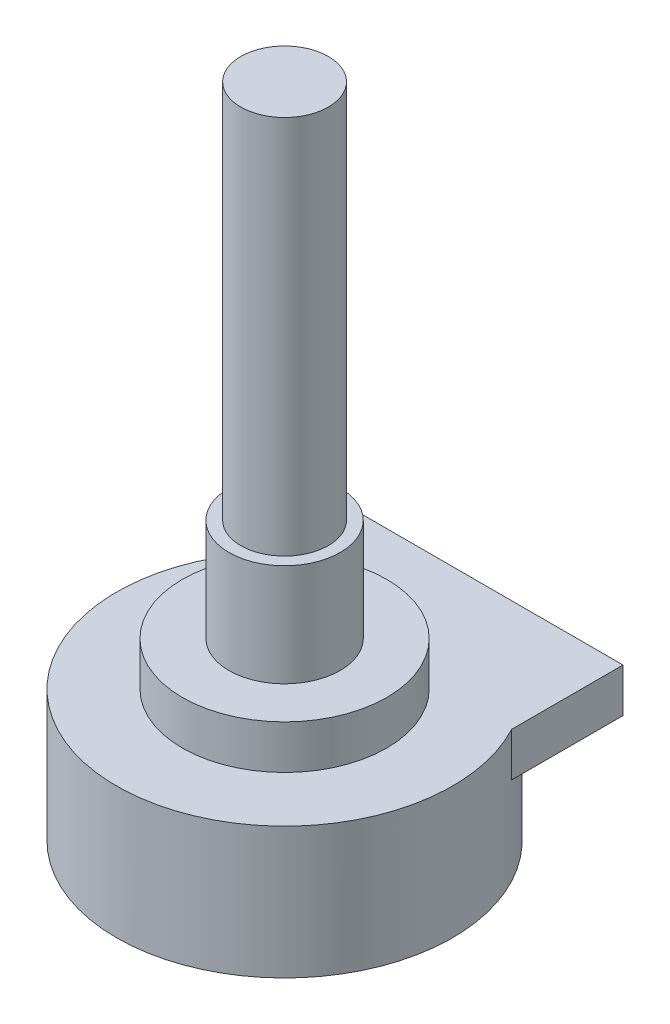
ISO-10303-21;
HEADER;
FILE_DESCRIPTION(('STEP AP214'),'2;1');
FILE_NAME('part.step','',(''),(''),'','','');
FILE_SCHEMA(('AUTOMOTIVE_DESIGN { 1 0 10303 214 1 1 1 1 }'));
ENDSEC;
DATA;
#1=APPLICATION_CONTEXT('core data for automotive mechanical design processes');
#2=APPLICATION_PROTOCOL_DEFINITION('international standard','automotive_design',2000,#1);
#3=PRODUCT_CONTEXT('',#1,'mechanical');
#4=PRODUCT('Part','Part','',(#3));
#5=PRODUCT_RELATED_PRODUCT_CATEGORY('part','',(#4));
#6=PRODUCT_DEFINITION_FORMATION('','',#4);
#7=PRODUCT_DEFINITION_CONTEXT('part definition',#1,'design');
#8=PRODUCT_DEFINITION('design','',#6,#7);
#9=PRODUCT_DEFINITION_SHAPE('','',#8);
#10=(LENGTH_UNIT() NAMED_UNIT(*) SI_UNIT(.MILLI.,.METRE.));
#11=(NAMED_UNIT(*) PLANE_ANGLE_UNIT() SI_UNIT($,.RADIAN.));
#12=(NAMED_UNIT(*) SI_UNIT($,.STERADIAN.) SOLID_ANGLE_UNIT());
#13=UNCERTAINTY_MEASURE_WITH_UNIT(LENGTH_MEASURE(1.E-05),#10,'distance_accuracy_value','');
#14=(GEOMETRIC_REPRESENTATION_CONTEXT(3) GLOBAL_UNCERTAINTY_ASSIGNED_CONTEXT((#13)) GLOBAL_UNIT_ASSIGNED_CONTEXT((#10,
#11,#12)) REPRESENTATION_CONTEXT('',''));
#15=CARTESIAN_POINT('',(0.,0.,0.));
#16=DIRECTION('',(0.,0.,1.));
#17=DIRECTION('',(1.,0.,0.));
#18=AXIS2_PLACEMENT_3D('',#15,#16,#17);
#19=CARTESIAN_POINT('',(11.2776,9.,0.));
#20=DIRECTION('',(1.,0.,0.));
#21=DIRECTION('',(0.,0.,-1.));
#22=AXIS2_PLACEMENT_3D('',#19,#20,#21);
#23=PLANE('',#22);
#24=DIRECTION('',(0.,-1.,0.));
#25=VECTOR('',#24,1.);
#26=CARTESIAN_POINT('',(11.2776,9.,-1.1684));
#27=LINE('',#26,#25);
#28=CARTESIAN_POINT('',(11.2776,9.,-1.1684));
#29=VERTEX_POINT('',#28);
#30=CARTESIAN_POINT('',(11.2776,6.,-1.1684));
#31=VERTEX_POINT('',#30);
#32=EDGE_CURVE('E92',#29,#31,#27,.T.);
#33=ORIENTED_EDGE('',*,*,#32,.T.);
#34=DIRECTION('',(0.,0.,1.));
#35=VECTOR('',#34,1.);
#36=CARTESIAN_POINT('',(11.2776,6.,-8.7884));
#37=LINE('',#36,#35);
#38=CARTESIAN_POINT('',(11.2776,6.,-8.7884));
#39=VERTEX_POINT('',#38);
#40=EDGE_CURVE('E80',#39,#31,#37,.T.);
#41=ORIENTED_EDGE('',*,*,#40,.F.);
#42=DIRECTION('',(0.,-1.,0.));
#43=VECTOR('',#42,1.);
#44=CARTESIAN_POINT('',(11.2776,9.,-8.7884));
#45=LINE('',#44,#43);
#46=CARTESIAN_POINT('',(11.2776,9.,-8.7884));
#47=VERTEX_POINT('',#46);
#48=EDGE_CURVE('E11',#47,#39,#45,.T.);
#49=ORIENTED_EDGE('',*,*,#48,.F.);
#50=DIRECTION('',(0.,0.,1.));
#51=VECTOR('',#50,1.);
#52=CARTESIAN_POINT('',(11.2776,9.,0.));
#53=LINE('',#52,#51);
#54=EDGE_CURVE('E107',#47,#29,#53,.T.);
#55=ORIENTED_EDGE('',*,*,#54,.T.);
#56=EDGE_LOOP('',(#33,#41,#49,#55));
#57=FACE_BOUND('',#56,.T.);
#58=ADVANCED_FACE('F36',(#57),#23,.T.);
#59=CARTESIAN_POINT('',(0.,9.,-8.7884));
#60=DIRECTION('',(0.,0.,-1.));
#61=DIRECTION('',(-1.,0.,0.));
#62=AXIS2_PLACEMENT_3D('',#59,#60,#61);
#63=PLANE('',#62);
#64=ORIENTED_EDGE('',*,*,#48,.T.);
#65=DIRECTION('',(1.,0.,0.));
#66=VECTOR('',#65,1.);
#67=CARTESIAN_POINT('',(-9.0424,6.,-8.7884));
#68=LINE('',#67,#66);
#69=CARTESIAN_POINT('',(-9.0424,6.,-8.7884));
#70=VERTEX_POINT('',#69);
#71=EDGE_CURVE('E89',#70,#39,#68,.T.);
#72=ORIENTED_EDGE('',*,*,#71,.F.);
#73=DIRECTION('',(0.,-1.,0.));
#74=VECTOR('',#73,1.);
#75=CARTESIAN_POINT('',(-9.0424,9.,-8.7884));
#76=LINE('',#75,#74);
#77=CARTESIAN_POINT('',(-9.0424,9.,-8.7884));
#78=VERTEX_POINT('',#77);
#79=EDGE_CURVE('E43',#78,#70,#76,.T.);
#80=ORIENTED_EDGE('',*,*,#79,.F.);
#81=DIRECTION('',(1.,0.,0.));
#82=VECTOR('',#81,1.);
#83=CARTESIAN_POINT('',(0.,9.,-8.7884));
#84=LINE('',#83,#82);
#85=EDGE_CURVE('E104',#78,#47,#84,.T.);
#86=ORIENTED_EDGE('',*,*,#85,.T.);
#87=EDGE_LOOP('',(#64,#72,#80,#86));
#88=FACE_BOUND('',#87,.T.);
#89=ADVANCED_FACE('F129',(#88),#63,.T.);
#90=CARTESIAN_POINT('',(-9.0424,9.,0.));
#91=DIRECTION('',(1.,0.,0.));
#92=DIRECTION('',(0.,0.,-1.));
#93=AXIS2_PLACEMENT_3D('',#90,#91,#92);
#94=PLANE('',#93);
#95=DIRECTION('',(0.,0.,-1.));
#96=VECTOR('',#95,1.);
#97=CARTESIAN_POINT('',(-9.0424,6.,-1.1684));
#98=LINE('',#97,#96);
#99=CARTESIAN_POINT('',(-9.0424,6.,-1.1684));
#100=VERTEX_POINT('',#99);
#101=EDGE_CURVE('E77',#100,#70,#98,.T.);
#102=ORIENTED_EDGE('',*,*,#101,.F.);
#103=DIRECTION('',(0.,-1.,0.));
#104=VECTOR('',#103,1.);
#105=CARTESIAN_POINT('',(-9.0424,9.,-1.1684));
#106=LINE('',#105,#104);
#107=CARTESIAN_POINT('',(-9.0424,9.,-1.1684));
#108=VERTEX_POINT('',#107);
#109=EDGE_CURVE('E88',#108,#100,#106,.T.);
#110=ORIENTED_EDGE('',*,*,#109,.F.);
#111=DIRECTION('',(0.,0.,1.));
#112=VECTOR('',#111,1.);
#113=CARTESIAN_POINT('',(-9.0424,9.,0.));
#114=LINE('',#113,#112);
#115=EDGE_CURVE('E102',#78,#108,#114,.T.);
#116=ORIENTED_EDGE('',*,*,#115,.F.);
#117=ORIENTED_EDGE('',*,*,#79,.T.);
#118=EDGE_LOOP('',(#102,#110,#116,#117));
#119=FACE_BOUND('',#118,.T.);
#120=ADVANCED_FACE('F86',(#119),#94,.F.);
#121=CARTESIAN_POINT('',(1.1176,9.,4.21902981392797));
#122=DIRECTION('',(0.,-1.,0.));
#123=DIRECTION('',(0.,0.,-1.));
#124=AXIS2_PLACEMENT_3D('',#121,#122,#123);
#125=CYLINDRICAL_SURFACE('',#124,11.5);
#126=CARTESIAN_POINT('',(1.1176,0.,4.21902981392797));
#127=DIRECTION('',(0.,1.,0.));
#128=DIRECTION('',(0.,0.,1.));
#129=AXIS2_PLACEMENT_3D('',#126,#127,#128);
#130=CIRCLE('',#129,11.5);
#131=CARTESIAN_POINT('',(1.1176,0.,15.719029813928));
#132=VERTEX_POINT('',#131);
#133=EDGE_CURVE('E96',#132,#132,#130,.T.);
#134=ORIENTED_EDGE('',*,*,#133,.T.);
#135=EDGE_LOOP('',(#134));
#136=FACE_BOUND('',#135,.T.);
#137=CARTESIAN_POINT('',(1.1176,6.,4.21902981392801));
#138=DIRECTION('',(0.,1.,0.));
#139=DIRECTION('',(0.,0.,-1.));
#140=AXIS2_PLACEMENT_3D('',#137,#138,#139);
#141=CIRCLE('',#140,11.5);
#142=EDGE_CURVE('E74',#31,#100,#141,.T.);
#143=ORIENTED_EDGE('',*,*,#142,.F.);
#144=ORIENTED_EDGE('',*,*,#32,.F.);
#145=CARTESIAN_POINT('',(1.1176,9.,4.21902981392797));
#146=DIRECTION('',(0.,1.,0.));
#147=DIRECTION('',(0.,0.,1.));
#148=AXIS2_PLACEMENT_3D('',#145,#146,#147);
#149=CIRCLE('',#148,11.5);
#150=EDGE_CURVE('E50',#108,#29,#149,.T.);
#151=ORIENTED_EDGE('',*,*,#150,.F.);
#152=ORIENTED_EDGE('',*,*,#109,.T.);
#153=EDGE_LOOP('',(#143,#144,#151,#152));
#154=FACE_BOUND('',#153,.T.);
#155=ADVANCED_FACE('F91',(#136,#154),#125,.T.);
#156=CARTESIAN_POINT('',(0.,9.,0.));
#157=DIRECTION('',(0.,1.,0.));
#158=DIRECTION('',(0.,0.,1.));
#159=AXIS2_PLACEMENT_3D('',#156,#157,#158);
#160=PLANE('',#159);
#161=CARTESIAN_POINT('',(1.1176,9.,4.21902981392797));
#162=DIRECTION('',(0.,1.,0.));
#163=DIRECTION('',(0.,0.,1.));
#164=AXIS2_PLACEMENT_3D('',#161,#162,#163);
#165=CIRCLE('',#164,7.);
#166=CARTESIAN_POINT('',(1.1176,9.,11.219029813928));
#167=VERTEX_POINT('',#166);
#168=EDGE_CURVE('E99',#167,#167,#165,.T.);
#169=ORIENTED_EDGE('',*,*,#168,.F.);
#170=EDGE_LOOP('',(#169));
#171=FACE_BOUND('',#170,.T.);
#172=ORIENTED_EDGE('',*,*,#54,.F.);
#173=ORIENTED_EDGE('',*,*,#85,.F.);
#174=ORIENTED_EDGE('',*,*,#115,.T.);
#175=ORIENTED_EDGE('',*,*,#150,.T.);
#176=EDGE_LOOP('',(#172,#173,#174,#175));
#177=FACE_BOUND('',#176,.T.);
#178=ADVANCED_FACE('F131',(#171,#177),#160,.T.);
#179=CARTESIAN_POINT('',(0.,0.,0.));
#180=DIRECTION('',(0.,1.,0.));
#181=DIRECTION('',(0.,0.,1.));
#182=AXIS2_PLACEMENT_3D('',#179,#180,#181);
#183=PLANE('',#182);
#184=ORIENTED_EDGE('',*,*,#133,.F.);
#185=EDGE_LOOP('',(#184));
#186=FACE_BOUND('',#185,.T.);
#187=ADVANCED_FACE('F133',(#186),#183,.F.);
#188=CARTESIAN_POINT('',(1.1176,12.,4.21902981392797));
#189=DIRECTION('',(0.,-1.,0.));
#190=DIRECTION('',(0.,0.,-1.));
#191=AXIS2_PLACEMENT_3D('',#188,#189,#190);
#192=CYLINDRICAL_SURFACE('',#191,7.);
#193=ORIENTED_EDGE('',*,*,#168,.T.);
#194=EDGE_LOOP('',(#193));
#195=FACE_BOUND('',#194,.T.);
#196=CARTESIAN_POINT('',(1.1176,12.,4.21902981392797));
#197=DIRECTION('',(0.,1.,0.));
#198=DIRECTION('',(0.,0.,1.));
#199=AXIS2_PLACEMENT_3D('',#196,#197,#198);
#200=CIRCLE('',#199,7.);
#201=CARTESIAN_POINT('',(1.1176,12.,11.219029813928));
#202=VERTEX_POINT('',#201);
#203=EDGE_CURVE('E100',#202,#202,#200,.T.);
#204=ORIENTED_EDGE('',*,*,#203,.F.);
#205=EDGE_LOOP('',(#204));
#206=FACE_BOUND('',#205,.T.);
#207=ADVANCED_FACE('F140',(#195,#206),#192,.T.);
#208=CARTESIAN_POINT('',(0.,12.,0.));
#209=DIRECTION('',(0.,1.,0.));
#210=DIRECTION('',(0.,0.,1.));
#211=AXIS2_PLACEMENT_3D('',#208,#209,#210);
#212=PLANE('',#211);
#213=CARTESIAN_POINT('',(1.1176,12.,4.21902981392797));
#214=DIRECTION('',(0.,1.,0.));
#215=DIRECTION('',(0.,0.,1.));
#216=AXIS2_PLACEMENT_3D('',#213,#214,#215);
#217=CIRCLE('',#216,3.81);
#218=CARTESIAN_POINT('',(1.1176,12.,8.02902981392797));
#219=VERTEX_POINT('',#218);
#220=EDGE_CURVE('E114',#219,#219,#217,.T.);
#221=ORIENTED_EDGE('',*,*,#220,.F.);
#222=EDGE_LOOP('',(#221));
#223=FACE_BOUND('',#222,.T.);
#224=ORIENTED_EDGE('',*,*,#203,.T.);
#225=EDGE_LOOP('',(#224));
#226=FACE_BOUND('',#225,.T.);
#227=ADVANCED_FACE('F213',(#223,#226),#212,.T.);
#228=CARTESIAN_POINT('',(1.1176,19.,4.21902981392797));
#229=DIRECTION('',(0.,-1.,0.));
#230=DIRECTION('',(0.,0.,-1.));
#231=AXIS2_PLACEMENT_3D('',#228,#229,#230);
#232=CYLINDRICAL_SURFACE('',#231,3.81);
#233=ORIENTED_EDGE('',*,*,#220,.T.);
#234=EDGE_LOOP('',(#233));
#235=FACE_BOUND('',#234,.T.);
#236=CARTESIAN_POINT('',(1.1176,19.,4.21902981392797));
#237=DIRECTION('',(0.,1.,0.));
#238=DIRECTION('',(0.,0.,1.));
#239=AXIS2_PLACEMENT_3D('',#236,#237,#238);
#240=CIRCLE('',#239,3.81);
#241=CARTESIAN_POINT('',(1.1176,19.,8.02902981392797));
#242=VERTEX_POINT('',#241);
#243=EDGE_CURVE('E117',#242,#242,#240,.T.);
#244=ORIENTED_EDGE('',*,*,#243,.F.);
#245=EDGE_LOOP('',(#244));
#246=FACE_BOUND('',#245,.T.);
#247=ADVANCED_FACE('F205',(#235,#246),#232,.T.);
#248=CARTESIAN_POINT('',(0.,19.,0.));
#249=DIRECTION('',(0.,1.,0.));
#250=DIRECTION('',(0.,0.,1.));
#251=AXIS2_PLACEMENT_3D('',#248,#249,#250);
#252=PLANE('',#251);
#253=CARTESIAN_POINT('',(1.1176,19.,4.21902981392797));
#254=DIRECTION('',(0.,1.,0.));
#255=DIRECTION('',(0.,0.,1.));
#256=AXIS2_PLACEMENT_3D('',#253,#254,#255);
#257=CIRCLE('',#256,3.);
#258=CARTESIAN_POINT('',(1.1176,19.,1.21902981392797));
#259=VERTEX_POINT('',#258);
#260=EDGE_CURVE('E120',#259,#259,#257,.T.);
#261=ORIENTED_EDGE('',*,*,#260,.F.);
#262=EDGE_LOOP('',(#261));
#263=FACE_BOUND('',#262,.T.);
#264=ORIENTED_EDGE('',*,*,#243,.T.);
#265=EDGE_LOOP('',(#264));
#266=FACE_BOUND('',#265,.T.);
#267=ADVANCED_FACE('F197',(#263,#266),#252,.T.);
#268=CARTESIAN_POINT('',(0.,45.,0.));
#269=DIRECTION('',(0.,1.,0.));
#270=DIRECTION('',(0.,0.,1.));
#271=AXIS2_PLACEMENT_3D('',#268,#269,#270);
#272=PLANE('',#271);
#273=CARTESIAN_POINT('',(1.1176,45.,4.21902981392797));
#274=DIRECTION('',(0.,1.,0.));
#275=DIRECTION('',(0.,0.,1.));
#276=AXIS2_PLACEMENT_3D('',#273,#274,#275);
#277=CIRCLE('',#276,3.);
#278=CARTESIAN_POINT('',(1.1176,45.,1.21902981392797));
#279=VERTEX_POINT('',#278);
#280=EDGE_CURVE('E123',#279,#279,#277,.T.);
#281=ORIENTED_EDGE('',*,*,#280,.T.);
#282=EDGE_LOOP('',(#281));
#283=FACE_BOUND('',#282,.T.);
#284=ADVANCED_FACE('F189',(#283),#272,.T.);
#285=CARTESIAN_POINT('',(1.1176,45.,4.21902981392797));
#286=DIRECTION('',(0.,-1.,0.));
#287=DIRECTION('',(0.,0.,-1.));
#288=AXIS2_PLACEMENT_3D('',#285,#286,#287);
#289=CYLINDRICAL_SURFACE('',#288,3.);
#290=CARTESIAN_POINT('',(1.1176,19.,1.21902981392797));
#291=CARTESIAN_POINT('',(1.1176,19.2708333333333,1.21902981392797));
#292=CARTESIAN_POINT('',(1.1176,19.5416666666667,1.21902981392797));
#293=CARTESIAN_POINT('',(1.1176,20.0833333333333,1.21902981392797));
#294=CARTESIAN_POINT('',(1.1176,20.3541666666667,1.21902981392797));
#295=CARTESIAN_POINT('',(1.1176,20.8958333333333,1.21902981392797));
#296=CARTESIAN_POINT('',(1.1176,21.1666666666667,1.21902981392797));
#297=CARTESIAN_POINT('',(1.1176,21.7083333333333,1.21902981392797));
#298=CARTESIAN_POINT('',(1.1176,21.9791666666667,1.21902981392797));
#299=CARTESIAN_POINT('',(1.1176,22.5208333333333,1.21902981392797));
#300=CARTESIAN_POINT('',(1.1176,22.7916666666667,1.21902981392797));
#301=CARTESIAN_POINT('',(1.1176,23.3333333333333,1.21902981392797));
#302=CARTESIAN_POINT('',(1.1176,23.6041666666667,1.21902981392797));
#303=CARTESIAN_POINT('',(1.1176,24.1458333333333,1.21902981392797));
#304=CARTESIAN_POINT('',(1.1176,24.4166666666667,1.21902981392797));
#305=CARTESIAN_POINT('',(1.1176,24.9583333333333,1.21902981392797));
#306=CARTESIAN_POINT('',(1.1176,25.2291666666667,1.21902981392797));
#307=CARTESIAN_POINT('',(1.1176,25.7708333333333,1.21902981392797));
#308=CARTESIAN_POINT('',(1.1176,26.0416666666667,1.21902981392797));
#309=CARTESIAN_POINT('',(1.1176,26.5833333333333,1.21902981392797));
#310=CARTESIAN_POINT('',(1.1176,26.8541666666667,1.21902981392797));
#311=CARTESIAN_POINT('',(1.1176,27.3958333333333,1.21902981392797));
#312=CARTESIAN_POINT('',(1.1176,27.6666666666667,1.21902981392797));
#313=CARTESIAN_POINT('',(1.1176,28.2083333333333,1.21902981392797));
#314=CARTESIAN_POINT('',(1.1176,28.4791666666667,1.21902981392797));
#315=CARTESIAN_POINT('',(1.1176,29.0208333333333,1.21902981392797));
#316=CARTESIAN_POINT('',(1.1176,29.2916666666667,1.21902981392797));
#317=CARTESIAN_POINT('',(1.1176,29.8333333333333,1.21902981392797));
#318=CARTESIAN_POINT('',(1.1176,30.1041666666667,1.21902981392797));
#319=CARTESIAN_POINT('',(1.1176,30.6458333333333,1.21902981392797));
#320=CARTESIAN_POINT('',(1.1176,30.9166666666667,1.21902981392797));
#321=CARTESIAN_POINT('',(1.1176,31.4583333333333,1.21902981392797));
#322=CARTESIAN_POINT('',(1.1176,31.7291666666667,1.21902981392797));
#323=CARTESIAN_POINT('',(1.1176,32.2708333333333,1.21902981392797));
#324=CARTESIAN_POINT('',(1.1176,32.5416666666667,1.21902981392797));
#325=CARTESIAN_POINT('',(1.1176,33.0833333333333,1.21902981392797));
#326=CARTESIAN_POINT('',(1.1176,33.3541666666667,1.21902981392797));
#327=CARTESIAN_POINT('',(1.1176,33.8958333333333,1.21902981392797));
#328=CARTESIAN_POINT('',(1.1176,34.1666666666667,1.21902981392797));
#329=CARTESIAN_POINT('',(1.1176,34.7083333333333,1.21902981392797));
#330=CARTESIAN_POINT('',(1.1176,34.9791666666667,1.21902981392797));
#331=CARTESIAN_POINT('',(1.1176,35.5208333333333,1.21902981392797));
#332=CARTESIAN_POINT('',(1.1176,35.7916666666667,1.21902981392797));
#333=CARTESIAN_POINT('',(1.1176,36.3333333333333,1.21902981392797));
#334=CARTESIAN_POINT('',(1.1176,36.6041666666667,1.21902981392797));
#335=CARTESIAN_POINT('',(1.1176,37.1458333333333,1.21902981392797));
#336=CARTESIAN_POINT('',(1.1176,37.4166666666667,1.21902981392797));
#337=CARTESIAN_POINT('',(1.1176,37.9583333333333,1.21902981392797));
#338=CARTESIAN_POINT('',(1.1176,38.2291666666667,1.21902981392797));
#339=CARTESIAN_POINT('',(1.1176,38.7708333333333,1.21902981392797));
#340=CARTESIAN_POINT('',(1.1176,39.0416666666667,1.21902981392797));
#341=CARTESIAN_POINT('',(1.1176,39.5833333333333,1.21902981392797));
#342=CARTESIAN_POINT('',(1.1176,39.8541666666667,1.21902981392797));
#343=CARTESIAN_POINT('',(1.1176,40.3958333333333,1.21902981392797));
#344=CARTESIAN_POINT('',(1.1176,40.6666666666667,1.21902981392797));
#345=CARTESIAN_POINT('',(1.1176,41.2083333333333,1.21902981392797));
#346=CARTESIAN_POINT('',(1.1176,41.4791666666667,1.21902981392797));
#347=CARTESIAN_POINT('',(1.1176,42.0208333333333,1.21902981392797));
#348=CARTESIAN_POINT('',(1.1176,42.2916666666667,1.21902981392797));
#349=CARTESIAN_POINT('',(1.1176,42.8333333333333,1.21902981392797));
#350=CARTESIAN_POINT('',(1.1176,43.1041666666667,1.21902981392797));
#351=CARTESIAN_POINT('',(1.1176,43.6458333333333,1.21902981392797));
#352=CARTESIAN_POINT('',(1.1176,43.9166666666667,1.21902981392797));
#353=CARTESIAN_POINT('',(1.1176,44.4583333333333,1.21902981392797));
#354=CARTESIAN_POINT('',(1.1176,44.7291666666667,1.21902981392797));
#355=CARTESIAN_POINT('',(1.1176,45.,1.21902981392797));
#356=B_SPLINE_CURVE_WITH_KNOTS('',3,(#290,#291,#292,#293,#294,#295,#296,#297,#298,#299,#300,
#301,#302,#303,#304,#305,#306,#307,#308,#309,#310,#311,#312,#313,#314,#315,#316,#317,#318,#319,
#320,#321,#322,#323,#324,#325,#326,#327,#328,#329,#330,#331,#332,#333,#334,#335,#336,#337,#338,
#339,#340,#341,#342,#343,#344,#345,#346,#347,#348,#349,#350,#351,#352,#353,#354,#355),
.UNSPECIFIED.,.F.,.F.,(4,2,2,2,2,2,2,2,2,2,2,2,2,2,2,2,2,2,2,2,2,2,2,2,2,2,2,2,2,2,2,2,4),(0.,
0.812500000000001,1.625,2.4375,3.25,4.0625,4.875,5.6875,6.5,7.3125,8.125,8.9375,9.75,10.5625,
11.375,12.1875,13.,13.8125,14.625,15.4375,16.25,17.0625,17.875,18.6875,19.5,20.3125,21.125,
21.9375,22.75,23.5625,24.375,25.1875,26.),.UNSPECIFIED.);
#357=EDGE_CURVE('BSEAM180',#259,#279,#356,.T.);
#358=ORIENTED_EDGE('',*,*,#260,.T.);
#359=ORIENTED_EDGE('',*,*,#280,.F.);
#360=ORIENTED_EDGE('',*,*,#357,.T.);
#361=ORIENTED_EDGE('',*,*,#357,.F.);
#362=EDGE_LOOP('',(#358,#360,#359,#361));
#363=FACE_BOUND('',#362,.T.);
#364=ADVANCED_FACE('F180',(#363),#289,.T.);
#365=CARTESIAN_POINT('',(1.1176,6.,4.21902981392801));
#366=DIRECTION('',(0.,-1.,0.));
#367=DIRECTION('',(0.,0.,-1.));
#368=AXIS2_PLACEMENT_3D('',#365,#366,#367);
#369=PLANE('',#368);
#370=ORIENTED_EDGE('',*,*,#142,.T.);
#371=ORIENTED_EDGE('',*,*,#101,.T.);
#372=ORIENTED_EDGE('',*,*,#71,.T.);
#373=ORIENTED_EDGE('',*,*,#40,.T.);
#374=EDGE_LOOP('',(#370,#371,#372,#373));
#375=FACE_BOUND('',#374,.T.);
#376=ADVANCED_FACE('F76',(#375),#369,.T.);
#377=CLOSED_SHELL('',(#58,#89,#120,#155,#178,#187,#207,#227,#247,#267,#284,#364,#376));
#378=MANIFOLD_SOLID_BREP('B2',#377);
#379=ADVANCED_BREP_SHAPE_REPRESENTATION('',(#18,#378),#14);
#380=SHAPE_DEFINITION_REPRESENTATION(#9,#379);
ENDSEC;
END-ISO-10303-21;
